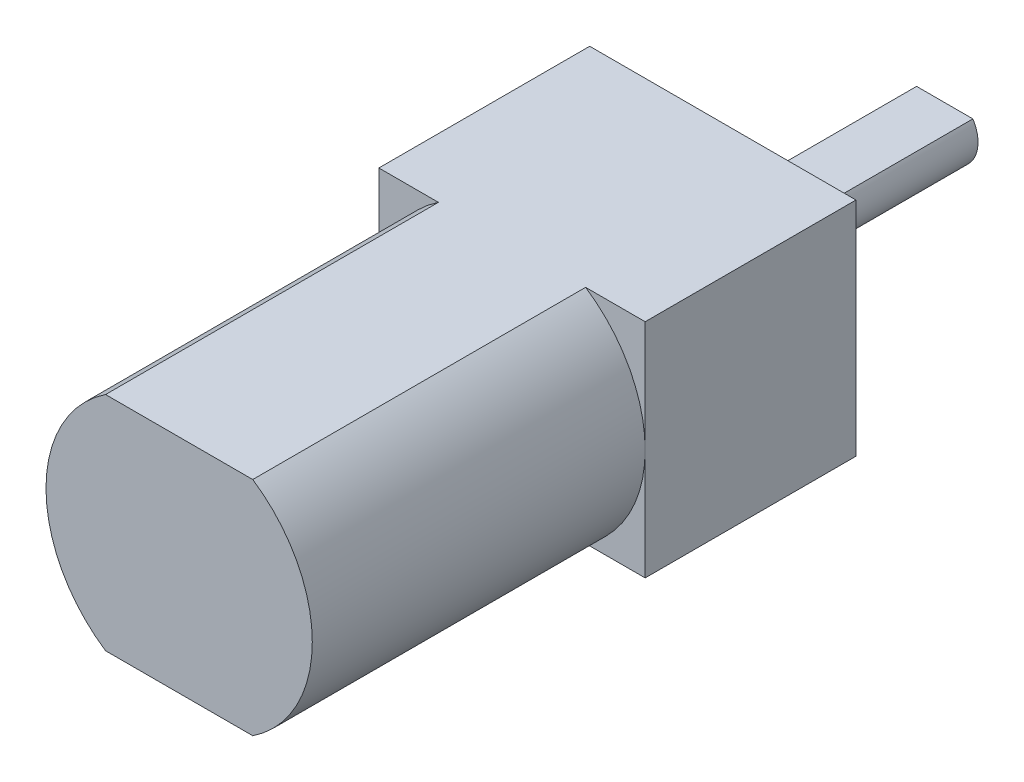
ISO-10303-21;
HEADER;
FILE_DESCRIPTION(('STEP AP214'),'2;1');
FILE_NAME('part.step','',(''),(''),'','','');
FILE_SCHEMA(('AUTOMOTIVE_DESIGN { 1 0 10303 214 1 1 1 1 }'));
ENDSEC;
DATA;
#1=APPLICATION_CONTEXT('core data for automotive mechanical design processes');
#2=APPLICATION_PROTOCOL_DEFINITION('international standard','automotive_design',2000,#1);
#3=PRODUCT_CONTEXT('',#1,'mechanical');
#4=PRODUCT('Part','Part','',(#3));
#5=PRODUCT_RELATED_PRODUCT_CATEGORY('part','',(#4));
#6=PRODUCT_DEFINITION_FORMATION('','',#4);
#7=PRODUCT_DEFINITION_CONTEXT('part definition',#1,'design');
#8=PRODUCT_DEFINITION('design','',#6,#7);
#9=PRODUCT_DEFINITION_SHAPE('','',#8);
#10=(LENGTH_UNIT() NAMED_UNIT(*) SI_UNIT(.MILLI.,.METRE.));
#11=(NAMED_UNIT(*) PLANE_ANGLE_UNIT() SI_UNIT($,.RADIAN.));
#12=(NAMED_UNIT(*) SI_UNIT($,.STERADIAN.) SOLID_ANGLE_UNIT());
#13=UNCERTAINTY_MEASURE_WITH_UNIT(LENGTH_MEASURE(1.E-05),#10,'distance_accuracy_value','');
#14=(GEOMETRIC_REPRESENTATION_CONTEXT(3) GLOBAL_UNCERTAINTY_ASSIGNED_CONTEXT((#13)) GLOBAL_UNIT_ASSIGNED_CONTEXT((#10,
#11,#12)) REPRESENTATION_CONTEXT('',''));
#15=CARTESIAN_POINT('',(0.,0.,0.));
#16=DIRECTION('',(0.,0.,1.));
#17=DIRECTION('',(1.,0.,0.));
#18=AXIS2_PLACEMENT_3D('',#15,#16,#17);
#19=CARTESIAN_POINT('',(0.,0.,-10.));
#20=DIRECTION('',(0.,0.,-1.));
#21=DIRECTION('',(-1.,0.,0.));
#22=AXIS2_PLACEMENT_3D('',#19,#20,#21);
#23=PLANE('',#22);
#24=CARTESIAN_POINT('',(0.,0.,-10.));
#25=DIRECTION('',(0.,0.,1.));
#26=DIRECTION('',(1.,0.,0.));
#27=AXIS2_PLACEMENT_3D('',#24,#25,#26);
#28=CIRCLE('',#27,1.5);
#29=CARTESIAN_POINT('',(-1.26885775404495,0.8,-10.));
#30=VERTEX_POINT('',#29);
#31=CARTESIAN_POINT('',(1.26885775404495,0.8,-10.));
#32=VERTEX_POINT('',#31);
#33=EDGE_CURVE('E19',#30,#32,#28,.T.);
#34=ORIENTED_EDGE('',*,*,#33,.F.);
#35=DIRECTION('',(1.,0.,0.));
#36=VECTOR('',#35,1.);
#37=CARTESIAN_POINT('',(1.26885775404495,0.8,-10.));
#38=LINE('',#37,#36);
#39=EDGE_CURVE('E177',#30,#32,#38,.T.);
#40=ORIENTED_EDGE('',*,*,#39,.T.);
#41=EDGE_LOOP('',(#34,#40));
#42=FACE_BOUND('',#41,.T.);
#43=ADVANCED_FACE('F16',(#42),#23,.T.);
#44=CARTESIAN_POINT('',(0.,0.,9.5));
#45=DIRECTION('',(0.,0.,1.));
#46=DIRECTION('',(1.,0.,0.));
#47=AXIS2_PLACEMENT_3D('',#44,#45,#46);
#48=PLANE('',#47);
#49=DIRECTION('',(-1.,0.,0.));
#50=VECTOR('',#49,1.);
#51=CARTESIAN_POINT('',(-6.,-5.,9.5));
#52=LINE('',#51,#50);
#53=CARTESIAN_POINT('',(-6.,-5.,9.5));
#54=VERTEX_POINT('',#53);
#55=CARTESIAN_POINT('',(-3.3166247903554,-5.,9.5));
#56=VERTEX_POINT('',#55);
#57=EDGE_CURVE('E184',#54,#56,#52,.F.);
#58=ORIENTED_EDGE('',*,*,#57,.T.);
#59=CARTESIAN_POINT('',(0.,0.,9.5));
#60=DIRECTION('',(0.,0.,1.));
#61=DIRECTION('',(1.,0.,0.));
#62=AXIS2_PLACEMENT_3D('',#59,#60,#61);
#63=CIRCLE('',#62,6.);
#64=CARTESIAN_POINT('',(-6.,0.,9.5));
#65=VERTEX_POINT('',#64);
#66=EDGE_CURVE('E193',#65,#56,#63,.T.);
#67=ORIENTED_EDGE('',*,*,#66,.F.);
#68=DIRECTION('',(0.,1.,0.));
#69=VECTOR('',#68,1.);
#70=CARTESIAN_POINT('',(-6.,5.,9.5));
#71=LINE('',#70,#69);
#72=EDGE_CURVE('E174',#65,#54,#71,.F.);
#73=ORIENTED_EDGE('',*,*,#72,.T.);
#74=EDGE_LOOP('',(#58,#67,#73));
#75=FACE_BOUND('',#74,.T.);
#76=ADVANCED_FACE('F250',(#75),#48,.T.);
#77=CARTESIAN_POINT('',(0.,0.,-10.));
#78=DIRECTION('',(0.,0.,1.));
#79=DIRECTION('',(1.,0.,0.));
#80=AXIS2_PLACEMENT_3D('',#77,#78,#79);
#81=CYLINDRICAL_SURFACE('',#80,1.5);
#82=ORIENTED_EDGE('',*,*,#33,.T.);
#83=DIRECTION('',(0.,0.,-1.));
#84=VECTOR('',#83,1.);
#85=CARTESIAN_POINT('',(1.26885775404495,0.8,0.));
#86=LINE('',#85,#84);
#87=CARTESIAN_POINT('',(1.26885775404495,0.8,0.));
#88=VERTEX_POINT('',#87);
#89=EDGE_CURVE('E107',#32,#88,#86,.F.);
#90=ORIENTED_EDGE('',*,*,#89,.T.);
#91=CARTESIAN_POINT('',(0.,0.,0.));
#92=DIRECTION('',(0.,0.,1.));
#93=DIRECTION('',(1.,0.,0.));
#94=AXIS2_PLACEMENT_3D('',#91,#92,#93);
#95=CIRCLE('',#94,1.5);
#96=CARTESIAN_POINT('',(-1.26885775404495,0.8,0.));
#97=VERTEX_POINT('',#96);
#98=EDGE_CURVE('E97',#88,#97,#95,.F.);
#99=ORIENTED_EDGE('',*,*,#98,.T.);
#100=DIRECTION('',(0.,0.,-1.));
#101=VECTOR('',#100,1.);
#102=CARTESIAN_POINT('',(-1.26885775404495,0.8,0.));
#103=LINE('',#102,#101);
#104=EDGE_CURVE('E112',#97,#30,#103,.T.);
#105=ORIENTED_EDGE('',*,*,#104,.T.);
#106=EDGE_LOOP('',(#82,#90,#99,#105));
#107=FACE_BOUND('',#106,.T.);
#108=ADVANCED_FACE('F108',(#107),#81,.T.);
#109=CARTESIAN_POINT('',(1.26885775404495,0.8,0.));
#110=DIRECTION('',(0.,-1.,0.));
#111=DIRECTION('',(0.,0.,-1.));
#112=AXIS2_PLACEMENT_3D('',#109,#110,#111);
#113=PLANE('',#112);
#114=ORIENTED_EDGE('',*,*,#104,.F.);
#115=DIRECTION('',(1.,0.,0.));
#116=VECTOR('',#115,1.);
#117=CARTESIAN_POINT('',(0.,0.8,0.));
#118=LINE('',#117,#116);
#119=EDGE_CURVE('E103',#97,#88,#118,.T.);
#120=ORIENTED_EDGE('',*,*,#119,.T.);
#121=ORIENTED_EDGE('',*,*,#89,.F.);
#122=ORIENTED_EDGE('',*,*,#39,.F.);
#123=EDGE_LOOP('',(#114,#120,#121,#122));
#124=FACE_BOUND('',#123,.T.);
#125=ADVANCED_FACE('F114',(#124),#113,.F.);
#126=CARTESIAN_POINT('',(-6.,-5.,24.5));
#127=DIRECTION('',(0.,1.,0.));
#128=DIRECTION('',(-1.,0.,0.));
#129=AXIS2_PLACEMENT_3D('',#126,#127,#128);
#130=PLANE('',#129);
#131=DIRECTION('',(0.,0.,1.));
#132=VECTOR('',#131,1.);
#133=CARTESIAN_POINT('',(-6.,-5.,24.5));
#134=LINE('',#133,#132);
#135=CARTESIAN_POINT('',(-6.,-5.,0.));
#136=VERTEX_POINT('',#135);
#137=EDGE_CURVE('E135',#54,#136,#134,.F.);
#138=ORIENTED_EDGE('',*,*,#137,.T.);
#139=DIRECTION('',(1.,0.,0.));
#140=VECTOR('',#139,1.);
#141=CARTESIAN_POINT('',(0.,-5.,0.));
#142=LINE('',#141,#140);
#143=CARTESIAN_POINT('',(6.,-5.,0.));
#144=VERTEX_POINT('',#143);
#145=EDGE_CURVE('E118',#136,#144,#142,.T.);
#146=ORIENTED_EDGE('',*,*,#145,.T.);
#147=DIRECTION('',(0.,0.,1.));
#148=VECTOR('',#147,1.);
#149=CARTESIAN_POINT('',(6.,-5.,24.5));
#150=LINE('',#149,#148);
#151=CARTESIAN_POINT('',(6.,-5.,9.5));
#152=VERTEX_POINT('',#151);
#153=EDGE_CURVE('E158',#144,#152,#150,.T.);
#154=ORIENTED_EDGE('',*,*,#153,.T.);
#155=DIRECTION('',(1.,0.,0.));
#156=VECTOR('',#155,1.);
#157=CARTESIAN_POINT('',(0.,-5.,9.5));
#158=LINE('',#157,#156);
#159=CARTESIAN_POINT('',(3.3166247903554,-5.,9.5));
#160=VERTEX_POINT('',#159);
#161=EDGE_CURVE('E153',#160,#152,#158,.T.);
#162=ORIENTED_EDGE('',*,*,#161,.F.);
#163=DIRECTION('',(0.,0.,1.));
#164=VECTOR('',#163,1.);
#165=CARTESIAN_POINT('',(3.3166247903554,-5.,24.5));
#166=LINE('',#165,#164);
#167=CARTESIAN_POINT('',(3.3166247903554,-5.,24.5));
#168=VERTEX_POINT('',#167);
#169=EDGE_CURVE('E187',#168,#160,#166,.F.);
#170=ORIENTED_EDGE('',*,*,#169,.F.);
#171=DIRECTION('',(1.,0.,0.));
#172=VECTOR('',#171,1.);
#173=CARTESIAN_POINT('',(0.,-5.,24.5));
#174=LINE('',#173,#172);
#175=CARTESIAN_POINT('',(-3.3166247903554,-5.,24.5));
#176=VERTEX_POINT('',#175);
#177=EDGE_CURVE('E149',#176,#168,#174,.T.);
#178=ORIENTED_EDGE('',*,*,#177,.F.);
#179=DIRECTION('',(0.,0.,1.));
#180=VECTOR('',#179,1.);
#181=CARTESIAN_POINT('',(-3.3166247903554,-5.,9.5));
#182=LINE('',#181,#180);
#183=EDGE_CURVE('E190',#56,#176,#182,.T.);
#184=ORIENTED_EDGE('',*,*,#183,.F.);
#185=ORIENTED_EDGE('',*,*,#57,.F.);
#186=EDGE_LOOP('',(#138,#146,#154,#162,#170,#178,#184,#185));
#187=FACE_BOUND('',#186,.T.);
#188=ADVANCED_FACE('F212',(#187),#130,.F.);
#189=CARTESIAN_POINT('',(0.,0.,9.5));
#190=DIRECTION('',(0.,0.,1.));
#191=DIRECTION('',(1.,0.,0.));
#192=AXIS2_PLACEMENT_3D('',#189,#190,#191);
#193=PLANE('',#192);
#194=CARTESIAN_POINT('',(0.,0.,9.5));
#195=DIRECTION('',(0.,0.,1.));
#196=DIRECTION('',(1.,0.,0.));
#197=AXIS2_PLACEMENT_3D('',#194,#195,#196);
#198=CIRCLE('',#197,6.);
#199=CARTESIAN_POINT('',(6.,0.,9.5));
#200=VERTEX_POINT('',#199);
#201=EDGE_CURVE('E162',#200,#160,#198,.F.);
#202=ORIENTED_EDGE('',*,*,#201,.T.);
#203=ORIENTED_EDGE('',*,*,#161,.T.);
#204=DIRECTION('',(0.,1.,0.));
#205=VECTOR('',#204,1.);
#206=CARTESIAN_POINT('',(6.,5.,9.5));
#207=LINE('',#206,#205);
#208=EDGE_CURVE('E154',#152,#200,#207,.T.);
#209=ORIENTED_EDGE('',*,*,#208,.T.);
#210=EDGE_LOOP('',(#202,#203,#209));
#211=FACE_BOUND('',#210,.T.);
#212=ADVANCED_FACE('F202',(#211),#193,.T.);
#213=CARTESIAN_POINT('',(0.,0.,9.5));
#214=DIRECTION('',(0.,0.,1.));
#215=DIRECTION('',(1.,0.,0.));
#216=AXIS2_PLACEMENT_3D('',#213,#214,#215);
#217=CYLINDRICAL_SURFACE('',#216,6.);
#218=DIRECTION('',(0.,0.,1.));
#219=VECTOR('',#218,1.);
#220=CARTESIAN_POINT('',(3.31662479035541,5.,24.5));
#221=LINE('',#220,#219);
#222=CARTESIAN_POINT('',(3.31662479035541,5.,9.5));
#223=VERTEX_POINT('',#222);
#224=CARTESIAN_POINT('',(3.31662479035541,5.,24.5));
#225=VERTEX_POINT('',#224);
#226=EDGE_CURVE('E148',#223,#225,#221,.T.);
#227=ORIENTED_EDGE('',*,*,#226,.T.);
#228=CARTESIAN_POINT('',(0.,0.,24.5));
#229=DIRECTION('',(0.,0.,1.));
#230=DIRECTION('',(1.,0.,0.));
#231=AXIS2_PLACEMENT_3D('',#228,#229,#230);
#232=CIRCLE('',#231,6.);
#233=EDGE_CURVE('E152',#168,#225,#232,.T.);
#234=ORIENTED_EDGE('',*,*,#233,.F.);
#235=ORIENTED_EDGE('',*,*,#169,.T.);
#236=ORIENTED_EDGE('',*,*,#201,.F.);
#237=CARTESIAN_POINT('',(0.,0.,9.5));
#238=DIRECTION('',(0.,0.,1.));
#239=DIRECTION('',(1.,0.,0.));
#240=AXIS2_PLACEMENT_3D('',#237,#238,#239);
#241=CIRCLE('',#240,6.);
#242=EDGE_CURVE('E157',#223,#200,#241,.F.);
#243=ORIENTED_EDGE('',*,*,#242,.F.);
#244=EDGE_LOOP('',(#227,#234,#235,#236,#243));
#245=FACE_BOUND('',#244,.T.);
#246=ADVANCED_FACE('F209',(#245),#217,.T.);
#247=CARTESIAN_POINT('',(0.,0.,24.5));
#248=DIRECTION('',(0.,0.,1.));
#249=DIRECTION('',(1.,0.,0.));
#250=AXIS2_PLACEMENT_3D('',#247,#248,#249);
#251=PLANE('',#250);
#252=ORIENTED_EDGE('',*,*,#177,.T.);
#253=ORIENTED_EDGE('',*,*,#233,.T.);
#254=DIRECTION('',(1.,0.,0.));
#255=VECTOR('',#254,1.);
#256=CARTESIAN_POINT('',(-6.,5.,24.5));
#257=LINE('',#256,#255);
#258=CARTESIAN_POINT('',(-3.3166247903554,5.,24.5));
#259=VERTEX_POINT('',#258);
#260=EDGE_CURVE('E145',#225,#259,#257,.F.);
#261=ORIENTED_EDGE('',*,*,#260,.T.);
#262=CARTESIAN_POINT('',(0.,0.,24.5));
#263=DIRECTION('',(0.,0.,1.));
#264=DIRECTION('',(1.,0.,0.));
#265=AXIS2_PLACEMENT_3D('',#262,#263,#264);
#266=CIRCLE('',#265,6.);
#267=EDGE_CURVE('E192',#176,#259,#266,.F.);
#268=ORIENTED_EDGE('',*,*,#267,.F.);
#269=EDGE_LOOP('',(#252,#253,#261,#268));
#270=FACE_BOUND('',#269,.T.);
#271=ADVANCED_FACE('F242',(#270),#251,.T.);
#272=CARTESIAN_POINT('',(0.,0.,9.5));
#273=DIRECTION('',(0.,0.,1.));
#274=DIRECTION('',(1.,0.,0.));
#275=AXIS2_PLACEMENT_3D('',#272,#273,#274);
#276=CYLINDRICAL_SURFACE('',#275,6.);
#277=ORIENTED_EDGE('',*,*,#183,.T.);
#278=ORIENTED_EDGE('',*,*,#267,.T.);
#279=DIRECTION('',(0.,0.,1.));
#280=VECTOR('',#279,1.);
#281=CARTESIAN_POINT('',(-3.3166247903554,5.,24.5));
#282=LINE('',#281,#280);
#283=CARTESIAN_POINT('',(-3.3166247903554,5.,9.5));
#284=VERTEX_POINT('',#283);
#285=EDGE_CURVE('E140',#259,#284,#282,.F.);
#286=ORIENTED_EDGE('',*,*,#285,.T.);
#287=CARTESIAN_POINT('',(0.,0.,9.5));
#288=DIRECTION('',(0.,0.,1.));
#289=DIRECTION('',(1.,0.,0.));
#290=AXIS2_PLACEMENT_3D('',#287,#288,#289);
#291=CIRCLE('',#290,6.);
#292=EDGE_CURVE('E181',#65,#284,#291,.F.);
#293=ORIENTED_EDGE('',*,*,#292,.F.);
#294=ORIENTED_EDGE('',*,*,#66,.T.);
#295=EDGE_LOOP('',(#277,#278,#286,#293,#294));
#296=FACE_BOUND('',#295,.T.);
#297=ADVANCED_FACE('F246',(#296),#276,.T.);
#298=CARTESIAN_POINT('',(0.,0.,9.5));
#299=DIRECTION('',(0.,0.,1.));
#300=DIRECTION('',(1.,0.,0.));
#301=AXIS2_PLACEMENT_3D('',#298,#299,#300);
#302=PLANE('',#301);
#303=DIRECTION('',(0.,1.,0.));
#304=VECTOR('',#303,1.);
#305=CARTESIAN_POINT('',(-6.,5.,9.5));
#306=LINE('',#305,#304);
#307=CARTESIAN_POINT('',(-6.,5.,9.5));
#308=VERTEX_POINT('',#307);
#309=EDGE_CURVE('E104',#308,#65,#306,.F.);
#310=ORIENTED_EDGE('',*,*,#309,.T.);
#311=ORIENTED_EDGE('',*,*,#292,.T.);
#312=DIRECTION('',(1.,0.,0.));
#313=VECTOR('',#312,1.);
#314=CARTESIAN_POINT('',(-6.,5.,9.5));
#315=LINE('',#314,#313);
#316=EDGE_CURVE('E130',#284,#308,#315,.F.);
#317=ORIENTED_EDGE('',*,*,#316,.T.);
#318=EDGE_LOOP('',(#310,#311,#317));
#319=FACE_BOUND('',#318,.T.);
#320=ADVANCED_FACE('F255',(#319),#302,.T.);
#321=CARTESIAN_POINT('',(-6.,5.,24.5));
#322=DIRECTION('',(1.,0.,0.));
#323=DIRECTION('',(0.,1.,0.));
#324=AXIS2_PLACEMENT_3D('',#321,#322,#323);
#325=PLANE('',#324);
#326=DIRECTION('',(0.,0.,1.));
#327=VECTOR('',#326,1.);
#328=CARTESIAN_POINT('',(-6.,5.,24.5));
#329=LINE('',#328,#327);
#330=CARTESIAN_POINT('',(-6.,5.,0.));
#331=VERTEX_POINT('',#330);
#332=EDGE_CURVE('E126',#308,#331,#329,.F.);
#333=ORIENTED_EDGE('',*,*,#332,.T.);
#334=DIRECTION('',(0.,1.,0.));
#335=VECTOR('',#334,1.);
#336=CARTESIAN_POINT('',(-6.,0.,0.));
#337=LINE('',#336,#335);
#338=EDGE_CURVE('E115',#331,#136,#337,.F.);
#339=ORIENTED_EDGE('',*,*,#338,.T.);
#340=ORIENTED_EDGE('',*,*,#137,.F.);
#341=ORIENTED_EDGE('',*,*,#72,.F.);
#342=ORIENTED_EDGE('',*,*,#309,.F.);
#343=EDGE_LOOP('',(#333,#339,#340,#341,#342));
#344=FACE_BOUND('',#343,.T.);
#345=ADVANCED_FACE('F252',(#344),#325,.F.);
#346=CARTESIAN_POINT('',(0.,0.,0.));
#347=DIRECTION('',(0.,0.,1.));
#348=DIRECTION('',(1.,0.,0.));
#349=AXIS2_PLACEMENT_3D('',#346,#347,#348);
#350=PLANE('',#349);
#351=ORIENTED_EDGE('',*,*,#145,.F.);
#352=ORIENTED_EDGE('',*,*,#338,.F.);
#353=DIRECTION('',(1.,0.,0.));
#354=VECTOR('',#353,1.);
#355=CARTESIAN_POINT('',(-6.,5.,0.));
#356=LINE('',#355,#354);
#357=CARTESIAN_POINT('',(6.,5.,0.));
#358=VERTEX_POINT('',#357);
#359=EDGE_CURVE('E129',#331,#358,#356,.T.);
#360=ORIENTED_EDGE('',*,*,#359,.T.);
#361=DIRECTION('',(0.,1.,0.));
#362=VECTOR('',#361,1.);
#363=CARTESIAN_POINT('',(6.,5.,0.));
#364=LINE('',#363,#362);
#365=EDGE_CURVE('E167',#358,#144,#364,.F.);
#366=ORIENTED_EDGE('',*,*,#365,.T.);
#367=EDGE_LOOP('',(#351,#352,#360,#366));
#368=FACE_BOUND('',#367,.T.);
#369=ORIENTED_EDGE('',*,*,#119,.F.);
#370=ORIENTED_EDGE('',*,*,#98,.F.);
#371=EDGE_LOOP('',(#369,#370));
#372=FACE_BOUND('',#371,.T.);
#373=ADVANCED_FACE('F101',(#368,#372),#350,.F.);
#374=CARTESIAN_POINT('',(6.,5.,24.5));
#375=DIRECTION('',(-1.,0.,0.));
#376=DIRECTION('',(0.,0.,1.));
#377=AXIS2_PLACEMENT_3D('',#374,#375,#376);
#378=PLANE('',#377);
#379=ORIENTED_EDGE('',*,*,#153,.F.);
#380=ORIENTED_EDGE('',*,*,#365,.F.);
#381=DIRECTION('',(0.,0.,1.));
#382=VECTOR('',#381,1.);
#383=CARTESIAN_POINT('',(6.,5.,24.5));
#384=LINE('',#383,#382);
#385=CARTESIAN_POINT('',(6.,5.,9.5));
#386=VERTEX_POINT('',#385);
#387=EDGE_CURVE('E25',#358,#386,#384,.T.);
#388=ORIENTED_EDGE('',*,*,#387,.T.);
#389=DIRECTION('',(0.,1.,0.));
#390=VECTOR('',#389,1.);
#391=CARTESIAN_POINT('',(6.,0.,9.5));
#392=LINE('',#391,#390);
#393=EDGE_CURVE('E33',#200,#386,#392,.T.);
#394=ORIENTED_EDGE('',*,*,#393,.F.);
#395=ORIENTED_EDGE('',*,*,#208,.F.);
#396=EDGE_LOOP('',(#379,#380,#388,#394,#395));
#397=FACE_BOUND('',#396,.T.);
#398=ADVANCED_FACE('F217',(#397),#378,.F.);
#399=CARTESIAN_POINT('',(0.,0.,9.5));
#400=DIRECTION('',(0.,0.,1.));
#401=DIRECTION('',(1.,0.,0.));
#402=AXIS2_PLACEMENT_3D('',#399,#400,#401);
#403=PLANE('',#402);
#404=ORIENTED_EDGE('',*,*,#242,.T.);
#405=ORIENTED_EDGE('',*,*,#393,.T.);
#406=DIRECTION('',(1.,0.,0.));
#407=VECTOR('',#406,1.);
#408=CARTESIAN_POINT('',(-6.,5.,9.5));
#409=LINE('',#408,#407);
#410=EDGE_CURVE('E11',#386,#223,#409,.F.);
#411=ORIENTED_EDGE('',*,*,#410,.T.);
#412=EDGE_LOOP('',(#404,#405,#411));
#413=FACE_BOUND('',#412,.T.);
#414=ADVANCED_FACE('F266',(#413),#403,.T.);
#415=CARTESIAN_POINT('',(-6.,5.,24.5));
#416=DIRECTION('',(0.,-1.,0.));
#417=DIRECTION('',(1.,0.,0.));
#418=AXIS2_PLACEMENT_3D('',#415,#416,#417);
#419=PLANE('',#418);
#420=ORIENTED_EDGE('',*,*,#387,.F.);
#421=ORIENTED_EDGE('',*,*,#359,.F.);
#422=ORIENTED_EDGE('',*,*,#332,.F.);
#423=ORIENTED_EDGE('',*,*,#316,.F.);
#424=ORIENTED_EDGE('',*,*,#285,.F.);
#425=ORIENTED_EDGE('',*,*,#260,.F.);
#426=ORIENTED_EDGE('',*,*,#226,.F.);
#427=ORIENTED_EDGE('',*,*,#410,.F.);
#428=EDGE_LOOP('',(#420,#421,#422,#423,#424,#425,#426,#427));
#429=FACE_BOUND('',#428,.T.);
#430=ADVANCED_FACE('F237',(#429),#419,.F.);
#431=CLOSED_SHELL('',(#43,#76,#108,#125,#188,#212,#246,#271,#297,#320,#345,#373,#398,#414,#430));
#432=MANIFOLD_SOLID_BREP('B1',#431);
#433=ADVANCED_BREP_SHAPE_REPRESENTATION('',(#18,#432),#14);
#434=SHAPE_DEFINITION_REPRESENTATION(#9,#433);
ENDSEC;
END-ISO-10303-21;
